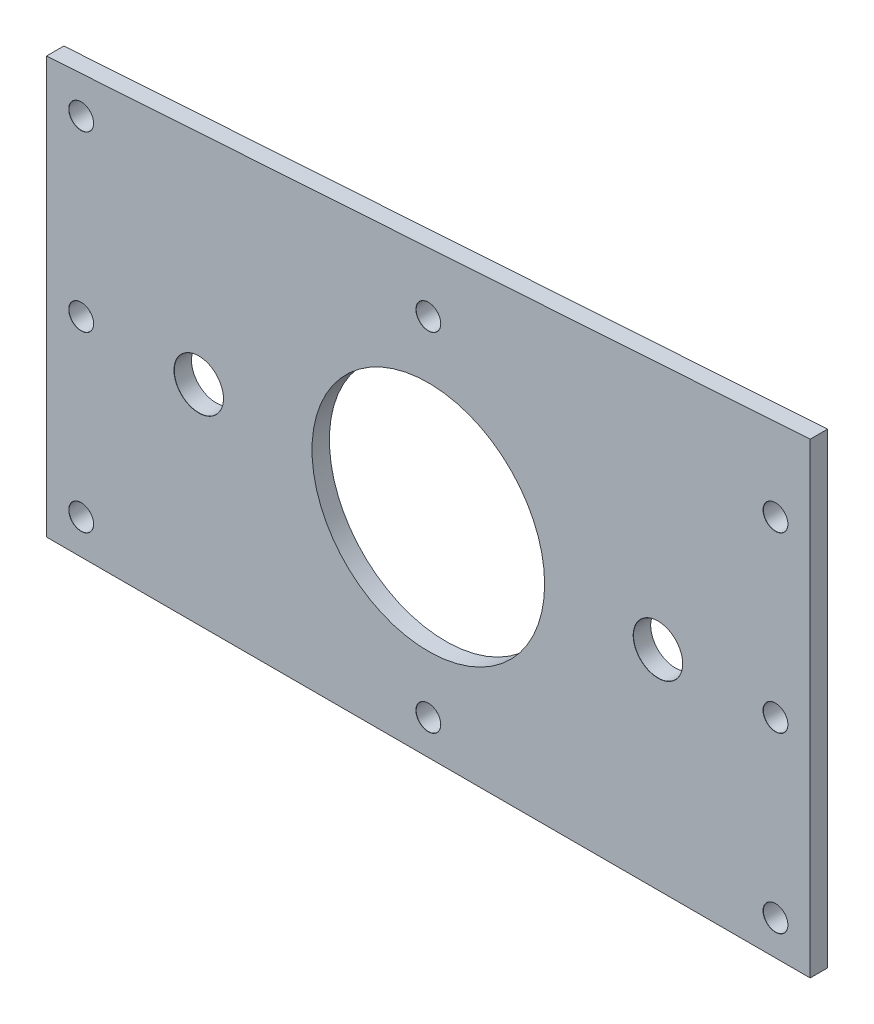
ISO-10303-21;
HEADER;
FILE_DESCRIPTION(('STEP AP214'),'2;1');
FILE_NAME('part.step','',(''),(''),'','','');
FILE_SCHEMA(('AUTOMOTIVE_DESIGN { 1 0 10303 214 1 1 1 1 }'));
ENDSEC;
DATA;
#1=APPLICATION_CONTEXT('core data for automotive mechanical design processes');
#2=APPLICATION_PROTOCOL_DEFINITION('international standard','automotive_design',2000,#1);
#3=PRODUCT_CONTEXT('',#1,'mechanical');
#4=PRODUCT('Part','Part','',(#3));
#5=PRODUCT_RELATED_PRODUCT_CATEGORY('part','',(#4));
#6=PRODUCT_DEFINITION_FORMATION('','',#4);
#7=PRODUCT_DEFINITION_CONTEXT('part definition',#1,'design');
#8=PRODUCT_DEFINITION('design','',#6,#7);
#9=PRODUCT_DEFINITION_SHAPE('','',#8);
#10=(LENGTH_UNIT() NAMED_UNIT(*) SI_UNIT(.MILLI.,.METRE.));
#11=(NAMED_UNIT(*) PLANE_ANGLE_UNIT() SI_UNIT($,.RADIAN.));
#12=(NAMED_UNIT(*) SI_UNIT($,.STERADIAN.) SOLID_ANGLE_UNIT());
#13=UNCERTAINTY_MEASURE_WITH_UNIT(LENGTH_MEASURE(1.E-05),#10,'distance_accuracy_value','');
#14=(GEOMETRIC_REPRESENTATION_CONTEXT(3) GLOBAL_UNCERTAINTY_ASSIGNED_CONTEXT((#13)) GLOBAL_UNIT_ASSIGNED_CONTEXT((#10,
#11,#12)) REPRESENTATION_CONTEXT('',''));
#15=CARTESIAN_POINT('',(0.,0.,0.));
#16=DIRECTION('',(0.,0.,1.));
#17=DIRECTION('',(1.,0.,0.));
#18=AXIS2_PLACEMENT_3D('',#15,#16,#17);
#19=CARTESIAN_POINT('',(69.85,38.1,3.175));
#20=DIRECTION('',(-1.,0.,0.));
#21=DIRECTION('',(0.,0.,1.));
#22=AXIS2_PLACEMENT_3D('',#19,#20,#21);
#23=PLANE('',#22);
#24=DIRECTION('',(0.,1.,0.));
#25=VECTOR('',#24,1.);
#26=CARTESIAN_POINT('',(69.85,38.1,0.));
#27=LINE('',#26,#25);
#28=CARTESIAN_POINT('',(69.85,-38.1,0.));
#29=VERTEX_POINT('',#28);
#30=CARTESIAN_POINT('',(69.85,47.2564217552889,0.));
#31=VERTEX_POINT('',#30);
#32=EDGE_CURVE('E72',#29,#31,#27,.T.);
#33=ORIENTED_EDGE('',*,*,#32,.T.);
#34=DIRECTION('',(0.,0.,-1.));
#35=VECTOR('',#34,1.);
#36=CARTESIAN_POINT('',(69.85,47.2564217552889,3.175));
#37=LINE('',#36,#35);
#38=CARTESIAN_POINT('',(69.85,47.2564217552889,3.175));
#39=VERTEX_POINT('',#38);
#40=EDGE_CURVE('E11',#39,#31,#37,.T.);
#41=ORIENTED_EDGE('',*,*,#40,.F.);
#42=DIRECTION('',(0.,1.,0.));
#43=VECTOR('',#42,1.);
#44=CARTESIAN_POINT('',(69.85,38.1,3.175));
#45=LINE('',#44,#43);
#46=CARTESIAN_POINT('',(69.85,-38.1,3.175));
#47=VERTEX_POINT('',#46);
#48=EDGE_CURVE('E77',#47,#39,#45,.T.);
#49=ORIENTED_EDGE('',*,*,#48,.F.);
#50=DIRECTION('',(0.,0.,-1.));
#51=VECTOR('',#50,1.);
#52=CARTESIAN_POINT('',(69.85,-38.1,3.175));
#53=LINE('',#52,#51);
#54=EDGE_CURVE('E92',#47,#29,#53,.T.);
#55=ORIENTED_EDGE('',*,*,#54,.T.);
#56=EDGE_LOOP('',(#33,#41,#49,#55));
#57=FACE_BOUND('',#56,.T.);
#58=ADVANCED_FACE('F32',(#57),#23,.F.);
#59=CARTESIAN_POINT('',(-69.85,38.1,3.175));
#60=DIRECTION('',(0.0654031292301437,-0.997858923238603,0.));
#61=DIRECTION('',(0.997858923238603,0.0654031292301437,0.));
#62=AXIS2_PLACEMENT_3D('',#59,#60,#61);
#63=PLANE('',#62);
#64=DIRECTION('',(-0.997858923238604,-0.0654031292301437,0.));
#65=VECTOR('',#64,1.);
#66=CARTESIAN_POINT('',(-69.85,38.1,0.));
#67=LINE('',#66,#65);
#68=CARTESIAN_POINT('',(-69.85,38.1,0.));
#69=VERTEX_POINT('',#68);
#70=EDGE_CURVE('E88',#31,#69,#67,.T.);
#71=ORIENTED_EDGE('',*,*,#70,.T.);
#72=DIRECTION('',(0.,0.,-1.));
#73=VECTOR('',#72,1.);
#74=CARTESIAN_POINT('',(-69.85,38.1,3.175));
#75=LINE('',#74,#73);
#76=CARTESIAN_POINT('',(-69.85,38.1,3.175));
#77=VERTEX_POINT('',#76);
#78=EDGE_CURVE('E40',#77,#69,#75,.T.);
#79=ORIENTED_EDGE('',*,*,#78,.F.);
#80=DIRECTION('',(-0.997858923238604,-0.0654031292301437,0.));
#81=VECTOR('',#80,1.);
#82=CARTESIAN_POINT('',(-69.85,38.1,3.175));
#83=LINE('',#82,#81);
#84=EDGE_CURVE('E80',#39,#77,#83,.T.);
#85=ORIENTED_EDGE('',*,*,#84,.F.);
#86=ORIENTED_EDGE('',*,*,#40,.T.);
#87=EDGE_LOOP('',(#71,#79,#85,#86));
#88=FACE_BOUND('',#87,.T.);
#89=ADVANCED_FACE('F87',(#88),#63,.F.);
#90=CARTESIAN_POINT('',(-69.85,38.1,3.175));
#91=DIRECTION('',(1.,0.,0.));
#92=DIRECTION('',(0.,0.,-1.));
#93=AXIS2_PLACEMENT_3D('',#90,#91,#92);
#94=PLANE('',#93);
#95=DIRECTION('',(0.,-1.,0.));
#96=VECTOR('',#95,1.);
#97=CARTESIAN_POINT('',(-69.85,38.1,0.));
#98=LINE('',#97,#96);
#99=CARTESIAN_POINT('',(-69.85,-38.1,0.));
#100=VERTEX_POINT('',#99);
#101=EDGE_CURVE('E65',#69,#100,#98,.T.);
#102=ORIENTED_EDGE('',*,*,#101,.T.);
#103=DIRECTION('',(0.,0.,-1.));
#104=VECTOR('',#103,1.);
#105=CARTESIAN_POINT('',(-69.85,-38.1,3.175));
#106=LINE('',#105,#104);
#107=CARTESIAN_POINT('',(-69.85,-38.1,3.175));
#108=VERTEX_POINT('',#107);
#109=EDGE_CURVE('E89',#108,#100,#106,.T.);
#110=ORIENTED_EDGE('',*,*,#109,.F.);
#111=DIRECTION('',(0.,-1.,0.));
#112=VECTOR('',#111,1.);
#113=CARTESIAN_POINT('',(-69.85,38.1,3.175));
#114=LINE('',#113,#112);
#115=EDGE_CURVE('E84',#77,#108,#114,.T.);
#116=ORIENTED_EDGE('',*,*,#115,.F.);
#117=ORIENTED_EDGE('',*,*,#78,.T.);
#118=EDGE_LOOP('',(#102,#110,#116,#117));
#119=FACE_BOUND('',#118,.T.);
#120=ADVANCED_FACE('F90',(#119),#94,.F.);
#121=CARTESIAN_POINT('',(-69.85,-38.1,3.175));
#122=DIRECTION('',(0.,1.,0.));
#123=DIRECTION('',(0.,0.,1.));
#124=AXIS2_PLACEMENT_3D('',#121,#122,#123);
#125=PLANE('',#124);
#126=DIRECTION('',(1.,0.,0.));
#127=VECTOR('',#126,1.);
#128=CARTESIAN_POINT('',(-69.85,-38.1,0.));
#129=LINE('',#128,#127);
#130=EDGE_CURVE('E100',#100,#29,#129,.T.);
#131=ORIENTED_EDGE('',*,*,#130,.T.);
#132=ORIENTED_EDGE('',*,*,#54,.F.);
#133=DIRECTION('',(1.,0.,0.));
#134=VECTOR('',#133,1.);
#135=CARTESIAN_POINT('',(-69.85,-38.1,3.175));
#136=LINE('',#135,#134);
#137=EDGE_CURVE('E48',#108,#47,#136,.T.);
#138=ORIENTED_EDGE('',*,*,#137,.F.);
#139=ORIENTED_EDGE('',*,*,#109,.T.);
#140=EDGE_LOOP('',(#131,#132,#138,#139));
#141=FACE_BOUND('',#140,.T.);
#142=ADVANCED_FACE('F105',(#141),#125,.F.);
#143=CARTESIAN_POINT('',(0.,0.,3.175));
#144=DIRECTION('',(0.,0.,1.));
#145=DIRECTION('',(1.,0.,0.));
#146=AXIS2_PLACEMENT_3D('',#143,#144,#145);
#147=PLANE('',#146);
#148=CARTESIAN_POINT('',(0.,0.,3.175));
#149=DIRECTION('',(0.,0.,1.));
#150=DIRECTION('',(1.,0.,0.));
#151=AXIS2_PLACEMENT_3D('',#148,#149,#150);
#152=CIRCLE('',#151,21.275);
#153=CARTESIAN_POINT('',(21.275,0.,3.175));
#154=VERTEX_POINT('',#153);
#155=EDGE_CURVE('E219',#154,#154,#152,.T.);
#156=ORIENTED_EDGE('',*,*,#155,.F.);
#157=EDGE_LOOP('',(#156));
#158=FACE_BOUND('',#157,.T.);
#159=CARTESIAN_POINT('',(-42.,0.,3.175));
#160=DIRECTION('',(0.,0.,1.));
#161=DIRECTION('',(1.,0.,0.));
#162=AXIS2_PLACEMENT_3D('',#159,#160,#161);
#163=CIRCLE('',#162,4.525);
#164=CARTESIAN_POINT('',(-37.475,0.,3.175));
#165=VERTEX_POINT('',#164);
#166=EDGE_CURVE('E215',#165,#165,#163,.T.);
#167=ORIENTED_EDGE('',*,*,#166,.F.);
#168=EDGE_LOOP('',(#167));
#169=FACE_BOUND('',#168,.T.);
#170=CARTESIAN_POINT('',(42.,0.,3.175));
#171=DIRECTION('',(0.,0.,1.));
#172=DIRECTION('',(1.,0.,0.));
#173=AXIS2_PLACEMENT_3D('',#170,#171,#172);
#174=CIRCLE('',#173,4.525);
#175=CARTESIAN_POINT('',(46.525,0.,3.175));
#176=VERTEX_POINT('',#175);
#177=EDGE_CURVE('E206',#176,#176,#174,.T.);
#178=ORIENTED_EDGE('',*,*,#177,.F.);
#179=EDGE_LOOP('',(#178));
#180=FACE_BOUND('',#179,.T.);
#181=CARTESIAN_POINT('',(-63.5,-31.75,3.175));
#182=DIRECTION('',(0.,0.,1.));
#183=DIRECTION('',(1.,0.,0.));
#184=AXIS2_PLACEMENT_3D('',#181,#182,#183);
#185=CIRCLE('',#184,2.275);
#186=CARTESIAN_POINT('',(-61.225,-31.75,3.175));
#187=VERTEX_POINT('',#186);
#188=EDGE_CURVE('E197',#187,#187,#185,.T.);
#189=ORIENTED_EDGE('',*,*,#188,.F.);
#190=EDGE_LOOP('',(#189));
#191=FACE_BOUND('',#190,.T.);
#192=CARTESIAN_POINT('',(0.,-31.75,3.175));
#193=DIRECTION('',(0.,0.,1.));
#194=DIRECTION('',(1.,0.,0.));
#195=AXIS2_PLACEMENT_3D('',#192,#193,#194);
#196=CIRCLE('',#195,2.275);
#197=CARTESIAN_POINT('',(2.275,-31.75,3.175));
#198=VERTEX_POINT('',#197);
#199=EDGE_CURVE('E188',#198,#198,#196,.T.);
#200=ORIENTED_EDGE('',*,*,#199,.F.);
#201=EDGE_LOOP('',(#200));
#202=FACE_BOUND('',#201,.T.);
#203=CARTESIAN_POINT('',(63.5,-31.75,3.175));
#204=DIRECTION('',(0.,0.,1.));
#205=DIRECTION('',(1.,0.,0.));
#206=AXIS2_PLACEMENT_3D('',#203,#204,#205);
#207=CIRCLE('',#206,2.275);
#208=CARTESIAN_POINT('',(65.775,-31.75,3.175));
#209=VERTEX_POINT('',#208);
#210=EDGE_CURVE('E179',#209,#209,#207,.T.);
#211=ORIENTED_EDGE('',*,*,#210,.F.);
#212=EDGE_LOOP('',(#211));
#213=FACE_BOUND('',#212,.T.);
#214=CARTESIAN_POINT('',(63.5,31.75,3.175));
#215=DIRECTION('',(0.,0.,1.));
#216=DIRECTION('',(1.,0.,0.));
#217=AXIS2_PLACEMENT_3D('',#214,#215,#216);
#218=CIRCLE('',#217,2.275);
#219=CARTESIAN_POINT('',(65.775,31.75,3.175));
#220=VERTEX_POINT('',#219);
#221=EDGE_CURVE('E170',#220,#220,#218,.T.);
#222=ORIENTED_EDGE('',*,*,#221,.F.);
#223=EDGE_LOOP('',(#222));
#224=FACE_BOUND('',#223,.T.);
#225=CARTESIAN_POINT('',(63.5,0.,3.175));
#226=DIRECTION('',(0.,0.,1.));
#227=DIRECTION('',(1.,0.,0.));
#228=AXIS2_PLACEMENT_3D('',#225,#226,#227);
#229=CIRCLE('',#228,2.275);
#230=CARTESIAN_POINT('',(65.775,0.,3.175));
#231=VERTEX_POINT('',#230);
#232=EDGE_CURVE('E161',#231,#231,#229,.T.);
#233=ORIENTED_EDGE('',*,*,#232,.F.);
#234=EDGE_LOOP('',(#233));
#235=FACE_BOUND('',#234,.T.);
#236=CARTESIAN_POINT('',(0.,31.75,3.175));
#237=DIRECTION('',(0.,0.,1.));
#238=DIRECTION('',(1.,0.,0.));
#239=AXIS2_PLACEMENT_3D('',#236,#237,#238);
#240=CIRCLE('',#239,2.275);
#241=CARTESIAN_POINT('',(2.27499999999999,31.75,3.175));
#242=VERTEX_POINT('',#241);
#243=EDGE_CURVE('E152',#242,#242,#240,.T.);
#244=ORIENTED_EDGE('',*,*,#243,.F.);
#245=EDGE_LOOP('',(#244));
#246=FACE_BOUND('',#245,.T.);
#247=CARTESIAN_POINT('',(-63.5,31.75,3.175));
#248=DIRECTION('',(0.,0.,1.));
#249=DIRECTION('',(1.,0.,0.));
#250=AXIS2_PLACEMENT_3D('',#247,#248,#249);
#251=CIRCLE('',#250,2.275);
#252=CARTESIAN_POINT('',(-61.225,31.75,3.175));
#253=VERTEX_POINT('',#252);
#254=EDGE_CURVE('E143',#253,#253,#251,.T.);
#255=ORIENTED_EDGE('',*,*,#254,.F.);
#256=EDGE_LOOP('',(#255));
#257=FACE_BOUND('',#256,.T.);
#258=CARTESIAN_POINT('',(-63.5,0.,3.175));
#259=DIRECTION('',(0.,0.,1.));
#260=DIRECTION('',(1.,0.,0.));
#261=AXIS2_PLACEMENT_3D('',#258,#259,#260);
#262=CIRCLE('',#261,2.275);
#263=CARTESIAN_POINT('',(-61.225,0.,3.175));
#264=VERTEX_POINT('',#263);
#265=EDGE_CURVE('E134',#264,#264,#262,.T.);
#266=ORIENTED_EDGE('',*,*,#265,.F.);
#267=EDGE_LOOP('',(#266));
#268=FACE_BOUND('',#267,.T.);
#269=ORIENTED_EDGE('',*,*,#48,.T.);
#270=ORIENTED_EDGE('',*,*,#84,.T.);
#271=ORIENTED_EDGE('',*,*,#115,.T.);
#272=ORIENTED_EDGE('',*,*,#137,.T.);
#273=EDGE_LOOP('',(#269,#270,#271,#272));
#274=FACE_BOUND('',#273,.T.);
#275=ADVANCED_FACE('F82',(#158,#169,#180,#191,#202,#213,#224,#235,#246,#257,#268,#274),#147,.T.);
#276=CARTESIAN_POINT('',(0.,0.,0.));
#277=DIRECTION('',(0.,0.,1.));
#278=DIRECTION('',(1.,0.,0.));
#279=AXIS2_PLACEMENT_3D('',#276,#277,#278);
#280=PLANE('',#279);
#281=CARTESIAN_POINT('',(0.,0.,0.));
#282=DIRECTION('',(0.,0.,1.));
#283=DIRECTION('',(1.,0.,0.));
#284=AXIS2_PLACEMENT_3D('',#281,#282,#283);
#285=CIRCLE('',#284,21.275);
#286=CARTESIAN_POINT('',(21.275,0.,0.));
#287=VERTEX_POINT('',#286);
#288=EDGE_CURVE('E218',#287,#287,#285,.T.);
#289=ORIENTED_EDGE('',*,*,#288,.T.);
#290=EDGE_LOOP('',(#289));
#291=FACE_BOUND('',#290,.T.);
#292=CARTESIAN_POINT('',(-42.,0.,0.));
#293=DIRECTION('',(0.,0.,1.));
#294=DIRECTION('',(1.,0.,0.));
#295=AXIS2_PLACEMENT_3D('',#292,#293,#294);
#296=CIRCLE('',#295,4.5);
#297=CARTESIAN_POINT('',(-37.5,0.,0.));
#298=VERTEX_POINT('',#297);
#299=EDGE_CURVE('E209',#298,#298,#296,.T.);
#300=ORIENTED_EDGE('',*,*,#299,.T.);
#301=EDGE_LOOP('',(#300));
#302=FACE_BOUND('',#301,.T.);
#303=CARTESIAN_POINT('',(42.,0.,0.));
#304=DIRECTION('',(0.,0.,1.));
#305=DIRECTION('',(1.,0.,0.));
#306=AXIS2_PLACEMENT_3D('',#303,#304,#305);
#307=CIRCLE('',#306,4.5);
#308=CARTESIAN_POINT('',(46.5,0.,0.));
#309=VERTEX_POINT('',#308);
#310=EDGE_CURVE('E200',#309,#309,#307,.T.);
#311=ORIENTED_EDGE('',*,*,#310,.T.);
#312=EDGE_LOOP('',(#311));
#313=FACE_BOUND('',#312,.T.);
#314=CARTESIAN_POINT('',(-63.5,-31.75,0.));
#315=DIRECTION('',(0.,0.,1.));
#316=DIRECTION('',(1.,0.,0.));
#317=AXIS2_PLACEMENT_3D('',#314,#315,#316);
#318=CIRCLE('',#317,2.25);
#319=CARTESIAN_POINT('',(-61.25,-31.75,0.));
#320=VERTEX_POINT('',#319);
#321=EDGE_CURVE('E191',#320,#320,#318,.T.);
#322=ORIENTED_EDGE('',*,*,#321,.T.);
#323=EDGE_LOOP('',(#322));
#324=FACE_BOUND('',#323,.T.);
#325=CARTESIAN_POINT('',(0.,-31.75,0.));
#326=DIRECTION('',(0.,0.,1.));
#327=DIRECTION('',(1.,0.,0.));
#328=AXIS2_PLACEMENT_3D('',#325,#326,#327);
#329=CIRCLE('',#328,2.25);
#330=CARTESIAN_POINT('',(2.25,-31.75,0.));
#331=VERTEX_POINT('',#330);
#332=EDGE_CURVE('E182',#331,#331,#329,.T.);
#333=ORIENTED_EDGE('',*,*,#332,.T.);
#334=EDGE_LOOP('',(#333));
#335=FACE_BOUND('',#334,.T.);
#336=CARTESIAN_POINT('',(63.5,-31.75,0.));
#337=DIRECTION('',(0.,0.,1.));
#338=DIRECTION('',(1.,0.,0.));
#339=AXIS2_PLACEMENT_3D('',#336,#337,#338);
#340=CIRCLE('',#339,2.25);
#341=CARTESIAN_POINT('',(65.75,-31.75,0.));
#342=VERTEX_POINT('',#341);
#343=EDGE_CURVE('E173',#342,#342,#340,.T.);
#344=ORIENTED_EDGE('',*,*,#343,.T.);
#345=EDGE_LOOP('',(#344));
#346=FACE_BOUND('',#345,.T.);
#347=CARTESIAN_POINT('',(63.5,31.75,0.));
#348=DIRECTION('',(0.,0.,1.));
#349=DIRECTION('',(1.,0.,0.));
#350=AXIS2_PLACEMENT_3D('',#347,#348,#349);
#351=CIRCLE('',#350,2.25);
#352=CARTESIAN_POINT('',(65.75,31.75,0.));
#353=VERTEX_POINT('',#352);
#354=EDGE_CURVE('E164',#353,#353,#351,.T.);
#355=ORIENTED_EDGE('',*,*,#354,.T.);
#356=EDGE_LOOP('',(#355));
#357=FACE_BOUND('',#356,.T.);
#358=CARTESIAN_POINT('',(63.5,0.,0.));
#359=DIRECTION('',(0.,0.,1.));
#360=DIRECTION('',(1.,0.,0.));
#361=AXIS2_PLACEMENT_3D('',#358,#359,#360);
#362=CIRCLE('',#361,2.25);
#363=CARTESIAN_POINT('',(65.75,0.,0.));
#364=VERTEX_POINT('',#363);
#365=EDGE_CURVE('E155',#364,#364,#362,.T.);
#366=ORIENTED_EDGE('',*,*,#365,.T.);
#367=EDGE_LOOP('',(#366));
#368=FACE_BOUND('',#367,.T.);
#369=CARTESIAN_POINT('',(0.,31.75,0.));
#370=DIRECTION('',(0.,0.,1.));
#371=DIRECTION('',(1.,0.,0.));
#372=AXIS2_PLACEMENT_3D('',#369,#370,#371);
#373=CIRCLE('',#372,2.25);
#374=CARTESIAN_POINT('',(2.24999999999999,31.75,0.));
#375=VERTEX_POINT('',#374);
#376=EDGE_CURVE('E146',#375,#375,#373,.T.);
#377=ORIENTED_EDGE('',*,*,#376,.T.);
#378=EDGE_LOOP('',(#377));
#379=FACE_BOUND('',#378,.T.);
#380=CARTESIAN_POINT('',(-63.5,31.75,0.));
#381=DIRECTION('',(0.,0.,1.));
#382=DIRECTION('',(1.,0.,0.));
#383=AXIS2_PLACEMENT_3D('',#380,#381,#382);
#384=CIRCLE('',#383,2.25);
#385=CARTESIAN_POINT('',(-61.25,31.75,0.));
#386=VERTEX_POINT('',#385);
#387=EDGE_CURVE('E137',#386,#386,#384,.T.);
#388=ORIENTED_EDGE('',*,*,#387,.T.);
#389=EDGE_LOOP('',(#388));
#390=FACE_BOUND('',#389,.T.);
#391=CARTESIAN_POINT('',(-63.5,0.,0.));
#392=DIRECTION('',(0.,0.,1.));
#393=DIRECTION('',(1.,0.,0.));
#394=AXIS2_PLACEMENT_3D('',#391,#392,#393);
#395=CIRCLE('',#394,2.25);
#396=CARTESIAN_POINT('',(-61.25,0.,0.));
#397=VERTEX_POINT('',#396);
#398=EDGE_CURVE('E97',#397,#397,#395,.T.);
#399=ORIENTED_EDGE('',*,*,#398,.T.);
#400=EDGE_LOOP('',(#399));
#401=FACE_BOUND('',#400,.T.);
#402=ORIENTED_EDGE('',*,*,#32,.F.);
#403=ORIENTED_EDGE('',*,*,#130,.F.);
#404=ORIENTED_EDGE('',*,*,#101,.F.);
#405=ORIENTED_EDGE('',*,*,#70,.F.);
#406=EDGE_LOOP('',(#402,#403,#404,#405));
#407=FACE_BOUND('',#406,.T.);
#408=ADVANCED_FACE('F106',(#291,#302,#313,#324,#335,#346,#357,#368,#379,#390,#401,#407),#280,.F.);
#409=CARTESIAN_POINT('',(-63.5,0.,3.175));
#410=DIRECTION('',(0.,0.,1.));
#411=DIRECTION('',(1.,0.,0.));
#412=AXIS2_PLACEMENT_3D('',#409,#410,#411);
#413=CYLINDRICAL_SURFACE('',#412,2.25);
#414=ORIENTED_EDGE('',*,*,#398,.F.);
#415=EDGE_LOOP('',(#414));
#416=FACE_BOUND('',#415,.T.);
#417=CARTESIAN_POINT('',(-63.5,0.,3.15));
#418=DIRECTION('',(0.,0.,1.));
#419=DIRECTION('',(1.,0.,0.));
#420=AXIS2_PLACEMENT_3D('',#417,#418,#419);
#421=CIRCLE('',#420,2.25);
#422=CARTESIAN_POINT('',(-61.25,0.,3.15));
#423=VERTEX_POINT('',#422);
#424=EDGE_CURVE('E131',#423,#423,#421,.T.);
#425=ORIENTED_EDGE('',*,*,#424,.T.);
#426=EDGE_LOOP('',(#425));
#427=FACE_BOUND('',#426,.T.);
#428=ADVANCED_FACE('F108',(#416,#427),#413,.F.);
#429=CARTESIAN_POINT('',(-63.5,0.,3.175));
#430=DIRECTION('',(0.,0.,1.));
#431=DIRECTION('',(1.,0.,0.));
#432=AXIS2_PLACEMENT_3D('',#429,#430,#431);
#433=CONICAL_SURFACE('',#432,2.275,0.785398163397353);
#434=ORIENTED_EDGE('',*,*,#424,.F.);
#435=EDGE_LOOP('',(#434));
#436=FACE_BOUND('',#435,.T.);
#437=ORIENTED_EDGE('',*,*,#265,.T.);
#438=EDGE_LOOP('',(#437));
#439=FACE_BOUND('',#438,.T.);
#440=ADVANCED_FACE('F115',(#436,#439),#433,.F.);
#441=CARTESIAN_POINT('',(-63.5,31.75,3.175));
#442=DIRECTION('',(0.,0.,1.));
#443=DIRECTION('',(1.,0.,0.));
#444=AXIS2_PLACEMENT_3D('',#441,#442,#443);
#445=CYLINDRICAL_SURFACE('',#444,2.25);
#446=ORIENTED_EDGE('',*,*,#387,.F.);
#447=EDGE_LOOP('',(#446));
#448=FACE_BOUND('',#447,.T.);
#449=CARTESIAN_POINT('',(-63.5,31.75,3.15));
#450=DIRECTION('',(0.,0.,1.));
#451=DIRECTION('',(1.,0.,0.));
#452=AXIS2_PLACEMENT_3D('',#449,#450,#451);
#453=CIRCLE('',#452,2.25);
#454=CARTESIAN_POINT('',(-61.25,31.75,3.15));
#455=VERTEX_POINT('',#454);
#456=EDGE_CURVE('E140',#455,#455,#453,.T.);
#457=ORIENTED_EDGE('',*,*,#456,.T.);
#458=EDGE_LOOP('',(#457));
#459=FACE_BOUND('',#458,.T.);
#460=ADVANCED_FACE('F252',(#448,#459),#445,.F.);
#461=CARTESIAN_POINT('',(-63.5,31.75,3.175));
#462=DIRECTION('',(0.,0.,1.));
#463=DIRECTION('',(1.,0.,0.));
#464=AXIS2_PLACEMENT_3D('',#461,#462,#463);
#465=CONICAL_SURFACE('',#464,2.275,0.785398163397353);
#466=ORIENTED_EDGE('',*,*,#456,.F.);
#467=EDGE_LOOP('',(#466));
#468=FACE_BOUND('',#467,.T.);
#469=ORIENTED_EDGE('',*,*,#254,.T.);
#470=EDGE_LOOP('',(#469));
#471=FACE_BOUND('',#470,.T.);
#472=ADVANCED_FACE('F258',(#468,#471),#465,.F.);
#473=CARTESIAN_POINT('',(0.,31.75,3.175));
#474=DIRECTION('',(0.,0.,1.));
#475=DIRECTION('',(1.,0.,0.));
#476=AXIS2_PLACEMENT_3D('',#473,#474,#475);
#477=CYLINDRICAL_SURFACE('',#476,2.25);
#478=ORIENTED_EDGE('',*,*,#376,.F.);
#479=EDGE_LOOP('',(#478));
#480=FACE_BOUND('',#479,.T.);
#481=CARTESIAN_POINT('',(0.,31.75,3.15));
#482=DIRECTION('',(0.,0.,1.));
#483=DIRECTION('',(1.,0.,0.));
#484=AXIS2_PLACEMENT_3D('',#481,#482,#483);
#485=CIRCLE('',#484,2.25);
#486=CARTESIAN_POINT('',(2.24999999999999,31.75,3.15));
#487=VERTEX_POINT('',#486);
#488=EDGE_CURVE('E149',#487,#487,#485,.T.);
#489=ORIENTED_EDGE('',*,*,#488,.T.);
#490=EDGE_LOOP('',(#489));
#491=FACE_BOUND('',#490,.T.);
#492=ADVANCED_FACE('F265',(#480,#491),#477,.F.);
#493=CARTESIAN_POINT('',(0.,31.75,3.175));
#494=DIRECTION('',(0.,0.,1.));
#495=DIRECTION('',(1.,0.,0.));
#496=AXIS2_PLACEMENT_3D('',#493,#494,#495);
#497=CONICAL_SURFACE('',#496,2.275,0.785398163397396);
#498=ORIENTED_EDGE('',*,*,#488,.F.);
#499=EDGE_LOOP('',(#498));
#500=FACE_BOUND('',#499,.T.);
#501=ORIENTED_EDGE('',*,*,#243,.T.);
#502=EDGE_LOOP('',(#501));
#503=FACE_BOUND('',#502,.T.);
#504=ADVANCED_FACE('F269',(#500,#503),#497,.F.);
#505=CARTESIAN_POINT('',(63.5,0.,3.175));
#506=DIRECTION('',(0.,0.,1.));
#507=DIRECTION('',(1.,0.,0.));
#508=AXIS2_PLACEMENT_3D('',#505,#506,#507);
#509=CYLINDRICAL_SURFACE('',#508,2.25);
#510=ORIENTED_EDGE('',*,*,#365,.F.);
#511=EDGE_LOOP('',(#510));
#512=FACE_BOUND('',#511,.T.);
#513=CARTESIAN_POINT('',(63.5,0.,3.15));
#514=DIRECTION('',(0.,0.,1.));
#515=DIRECTION('',(1.,0.,0.));
#516=AXIS2_PLACEMENT_3D('',#513,#514,#515);
#517=CIRCLE('',#516,2.25);
#518=CARTESIAN_POINT('',(65.75,0.,3.15));
#519=VERTEX_POINT('',#518);
#520=EDGE_CURVE('E158',#519,#519,#517,.T.);
#521=ORIENTED_EDGE('',*,*,#520,.T.);
#522=EDGE_LOOP('',(#521));
#523=FACE_BOUND('',#522,.T.);
#524=ADVANCED_FACE('F273',(#512,#523),#509,.F.);
#525=CARTESIAN_POINT('',(63.5,0.,3.175));
#526=DIRECTION('',(0.,0.,1.));
#527=DIRECTION('',(1.,0.,0.));
#528=AXIS2_PLACEMENT_3D('',#525,#526,#527);
#529=CONICAL_SURFACE('',#528,2.275,0.785398163397353);
#530=ORIENTED_EDGE('',*,*,#520,.F.);
#531=EDGE_LOOP('',(#530));
#532=FACE_BOUND('',#531,.T.);
#533=ORIENTED_EDGE('',*,*,#232,.T.);
#534=EDGE_LOOP('',(#533));
#535=FACE_BOUND('',#534,.T.);
#536=ADVANCED_FACE('F277',(#532,#535),#529,.F.);
#537=CARTESIAN_POINT('',(63.5,31.75,3.175));
#538=DIRECTION('',(0.,0.,1.));
#539=DIRECTION('',(1.,0.,0.));
#540=AXIS2_PLACEMENT_3D('',#537,#538,#539);
#541=CYLINDRICAL_SURFACE('',#540,2.25);
#542=ORIENTED_EDGE('',*,*,#354,.F.);
#543=EDGE_LOOP('',(#542));
#544=FACE_BOUND('',#543,.T.);
#545=CARTESIAN_POINT('',(63.5,31.75,3.15));
#546=DIRECTION('',(0.,0.,1.));
#547=DIRECTION('',(1.,0.,0.));
#548=AXIS2_PLACEMENT_3D('',#545,#546,#547);
#549=CIRCLE('',#548,2.25);
#550=CARTESIAN_POINT('',(65.75,31.75,3.15));
#551=VERTEX_POINT('',#550);
#552=EDGE_CURVE('E167',#551,#551,#549,.T.);
#553=ORIENTED_EDGE('',*,*,#552,.T.);
#554=EDGE_LOOP('',(#553));
#555=FACE_BOUND('',#554,.T.);
#556=ADVANCED_FACE('F281',(#544,#555),#541,.F.);
#557=CARTESIAN_POINT('',(63.5,31.75,3.175));
#558=DIRECTION('',(0.,0.,1.));
#559=DIRECTION('',(1.,0.,0.));
#560=AXIS2_PLACEMENT_3D('',#557,#558,#559);
#561=CONICAL_SURFACE('',#560,2.275,0.785398163397353);
#562=ORIENTED_EDGE('',*,*,#552,.F.);
#563=EDGE_LOOP('',(#562));
#564=FACE_BOUND('',#563,.T.);
#565=ORIENTED_EDGE('',*,*,#221,.T.);
#566=EDGE_LOOP('',(#565));
#567=FACE_BOUND('',#566,.T.);
#568=ADVANCED_FACE('F285',(#564,#567),#561,.F.);
#569=CARTESIAN_POINT('',(63.5,-31.75,3.175));
#570=DIRECTION('',(0.,0.,1.));
#571=DIRECTION('',(1.,0.,0.));
#572=AXIS2_PLACEMENT_3D('',#569,#570,#571);
#573=CYLINDRICAL_SURFACE('',#572,2.25);
#574=ORIENTED_EDGE('',*,*,#343,.F.);
#575=EDGE_LOOP('',(#574));
#576=FACE_BOUND('',#575,.T.);
#577=CARTESIAN_POINT('',(63.5,-31.75,3.15));
#578=DIRECTION('',(0.,0.,1.));
#579=DIRECTION('',(1.,0.,0.));
#580=AXIS2_PLACEMENT_3D('',#577,#578,#579);
#581=CIRCLE('',#580,2.25);
#582=CARTESIAN_POINT('',(65.75,-31.75,3.15));
#583=VERTEX_POINT('',#582);
#584=EDGE_CURVE('E176',#583,#583,#581,.T.);
#585=ORIENTED_EDGE('',*,*,#584,.T.);
#586=EDGE_LOOP('',(#585));
#587=FACE_BOUND('',#586,.T.);
#588=ADVANCED_FACE('F289',(#576,#587),#573,.F.);
#589=CARTESIAN_POINT('',(63.5,-31.75,3.175));
#590=DIRECTION('',(0.,0.,1.));
#591=DIRECTION('',(1.,0.,0.));
#592=AXIS2_PLACEMENT_3D('',#589,#590,#591);
#593=CONICAL_SURFACE('',#592,2.275,0.785398163397353);
#594=ORIENTED_EDGE('',*,*,#584,.F.);
#595=EDGE_LOOP('',(#594));
#596=FACE_BOUND('',#595,.T.);
#597=ORIENTED_EDGE('',*,*,#210,.T.);
#598=EDGE_LOOP('',(#597));
#599=FACE_BOUND('',#598,.T.);
#600=ADVANCED_FACE('F293',(#596,#599),#593,.F.);
#601=CARTESIAN_POINT('',(0.,-31.75,3.175));
#602=DIRECTION('',(0.,0.,1.));
#603=DIRECTION('',(1.,0.,0.));
#604=AXIS2_PLACEMENT_3D('',#601,#602,#603);
#605=CYLINDRICAL_SURFACE('',#604,2.25);
#606=ORIENTED_EDGE('',*,*,#332,.F.);
#607=EDGE_LOOP('',(#606));
#608=FACE_BOUND('',#607,.T.);
#609=CARTESIAN_POINT('',(0.,-31.75,3.15));
#610=DIRECTION('',(0.,0.,1.));
#611=DIRECTION('',(1.,0.,0.));
#612=AXIS2_PLACEMENT_3D('',#609,#610,#611);
#613=CIRCLE('',#612,2.25);
#614=CARTESIAN_POINT('',(2.25,-31.75,3.15));
#615=VERTEX_POINT('',#614);
#616=EDGE_CURVE('E185',#615,#615,#613,.T.);
#617=ORIENTED_EDGE('',*,*,#616,.T.);
#618=EDGE_LOOP('',(#617));
#619=FACE_BOUND('',#618,.T.);
#620=ADVANCED_FACE('F297',(#608,#619),#605,.F.);
#621=CARTESIAN_POINT('',(0.,-31.75,3.175));
#622=DIRECTION('',(0.,0.,1.));
#623=DIRECTION('',(1.,0.,0.));
#624=AXIS2_PLACEMENT_3D('',#621,#622,#623);
#625=CONICAL_SURFACE('',#624,2.275,0.785398163397396);
#626=ORIENTED_EDGE('',*,*,#616,.F.);
#627=EDGE_LOOP('',(#626));
#628=FACE_BOUND('',#627,.T.);
#629=ORIENTED_EDGE('',*,*,#199,.T.);
#630=EDGE_LOOP('',(#629));
#631=FACE_BOUND('',#630,.T.);
#632=ADVANCED_FACE('F301',(#628,#631),#625,.F.);
#633=CARTESIAN_POINT('',(-63.5,-31.75,3.175));
#634=DIRECTION('',(0.,0.,1.));
#635=DIRECTION('',(1.,0.,0.));
#636=AXIS2_PLACEMENT_3D('',#633,#634,#635);
#637=CYLINDRICAL_SURFACE('',#636,2.25);
#638=ORIENTED_EDGE('',*,*,#321,.F.);
#639=EDGE_LOOP('',(#638));
#640=FACE_BOUND('',#639,.T.);
#641=CARTESIAN_POINT('',(-63.5,-31.75,3.15));
#642=DIRECTION('',(0.,0.,1.));
#643=DIRECTION('',(1.,0.,0.));
#644=AXIS2_PLACEMENT_3D('',#641,#642,#643);
#645=CIRCLE('',#644,2.25);
#646=CARTESIAN_POINT('',(-61.25,-31.75,3.15));
#647=VERTEX_POINT('',#646);
#648=EDGE_CURVE('E194',#647,#647,#645,.T.);
#649=ORIENTED_EDGE('',*,*,#648,.T.);
#650=EDGE_LOOP('',(#649));
#651=FACE_BOUND('',#650,.T.);
#652=ADVANCED_FACE('F305',(#640,#651),#637,.F.);
#653=CARTESIAN_POINT('',(-63.5,-31.75,3.175));
#654=DIRECTION('',(0.,0.,1.));
#655=DIRECTION('',(1.,0.,0.));
#656=AXIS2_PLACEMENT_3D('',#653,#654,#655);
#657=CONICAL_SURFACE('',#656,2.275,0.785398163397353);
#658=ORIENTED_EDGE('',*,*,#648,.F.);
#659=EDGE_LOOP('',(#658));
#660=FACE_BOUND('',#659,.T.);
#661=ORIENTED_EDGE('',*,*,#188,.T.);
#662=EDGE_LOOP('',(#661));
#663=FACE_BOUND('',#662,.T.);
#664=ADVANCED_FACE('F309',(#660,#663),#657,.F.);
#665=CARTESIAN_POINT('',(42.,0.,3.175));
#666=DIRECTION('',(0.,0.,1.));
#667=DIRECTION('',(1.,0.,0.));
#668=AXIS2_PLACEMENT_3D('',#665,#666,#667);
#669=CYLINDRICAL_SURFACE('',#668,4.5);
#670=ORIENTED_EDGE('',*,*,#310,.F.);
#671=EDGE_LOOP('',(#670));
#672=FACE_BOUND('',#671,.T.);
#673=CARTESIAN_POINT('',(42.,0.,3.15));
#674=DIRECTION('',(0.,0.,1.));
#675=DIRECTION('',(1.,0.,0.));
#676=AXIS2_PLACEMENT_3D('',#673,#674,#675);
#677=CIRCLE('',#676,4.5);
#678=CARTESIAN_POINT('',(46.5,0.,3.15));
#679=VERTEX_POINT('',#678);
#680=EDGE_CURVE('E203',#679,#679,#677,.T.);
#681=ORIENTED_EDGE('',*,*,#680,.T.);
#682=EDGE_LOOP('',(#681));
#683=FACE_BOUND('',#682,.T.);
#684=ADVANCED_FACE('F313',(#672,#683),#669,.F.);
#685=CARTESIAN_POINT('',(42.,0.,3.175));
#686=DIRECTION('',(0.,0.,1.));
#687=DIRECTION('',(1.,0.,0.));
#688=AXIS2_PLACEMENT_3D('',#685,#686,#687);
#689=CONICAL_SURFACE('',#688,4.525,0.7853981633975);
#690=ORIENTED_EDGE('',*,*,#680,.F.);
#691=EDGE_LOOP('',(#690));
#692=FACE_BOUND('',#691,.T.);
#693=ORIENTED_EDGE('',*,*,#177,.T.);
#694=EDGE_LOOP('',(#693));
#695=FACE_BOUND('',#694,.T.);
#696=ADVANCED_FACE('F317',(#692,#695),#689,.F.);
#697=CARTESIAN_POINT('',(-42.,0.,3.175));
#698=DIRECTION('',(0.,0.,1.));
#699=DIRECTION('',(1.,0.,0.));
#700=AXIS2_PLACEMENT_3D('',#697,#698,#699);
#701=CYLINDRICAL_SURFACE('',#700,4.5);
#702=ORIENTED_EDGE('',*,*,#299,.F.);
#703=EDGE_LOOP('',(#702));
#704=FACE_BOUND('',#703,.T.);
#705=CARTESIAN_POINT('',(-42.,0.,3.15));
#706=DIRECTION('',(0.,0.,1.));
#707=DIRECTION('',(1.,0.,0.));
#708=AXIS2_PLACEMENT_3D('',#705,#706,#707);
#709=CIRCLE('',#708,4.5);
#710=CARTESIAN_POINT('',(-37.5,0.,3.15));
#711=VERTEX_POINT('',#710);
#712=EDGE_CURVE('E212',#711,#711,#709,.T.);
#713=ORIENTED_EDGE('',*,*,#712,.T.);
#714=EDGE_LOOP('',(#713));
#715=FACE_BOUND('',#714,.T.);
#716=ADVANCED_FACE('F321',(#704,#715),#701,.F.);
#717=CARTESIAN_POINT('',(-42.,0.,3.175));
#718=DIRECTION('',(0.,0.,1.));
#719=DIRECTION('',(1.,0.,0.));
#720=AXIS2_PLACEMENT_3D('',#717,#718,#719);
#721=CONICAL_SURFACE('',#720,4.525,0.7853981633975);
#722=ORIENTED_EDGE('',*,*,#712,.F.);
#723=EDGE_LOOP('',(#722));
#724=FACE_BOUND('',#723,.T.);
#725=ORIENTED_EDGE('',*,*,#166,.T.);
#726=EDGE_LOOP('',(#725));
#727=FACE_BOUND('',#726,.T.);
#728=ADVANCED_FACE('F227',(#724,#727),#721,.F.);
#729=CARTESIAN_POINT('',(0.,0.,0.));
#730=DIRECTION('',(0.,0.,1.));
#731=DIRECTION('',(1.,0.,0.));
#732=AXIS2_PLACEMENT_3D('',#729,#730,#731);
#733=CYLINDRICAL_SURFACE('',#732,21.275);
#734=ORIENTED_EDGE('',*,*,#288,.F.);
#735=EDGE_LOOP('',(#734));
#736=FACE_BOUND('',#735,.T.);
#737=ORIENTED_EDGE('',*,*,#155,.T.);
#738=EDGE_LOOP('',(#737));
#739=FACE_BOUND('',#738,.T.);
#740=ADVANCED_FACE('F224',(#736,#739),#733,.F.);
#741=CLOSED_SHELL('',(#58,#89,#120,#142,#275,#408,#428,#440,#460,#472,#492,#504,#524,#536,#556,
#568,#588,#600,#620,#632,#652,#664,#684,#696,#716,#728,#740));
#742=MANIFOLD_SOLID_BREP('B2',#741);
#743=ADVANCED_BREP_SHAPE_REPRESENTATION('',(#18,#742),#14);
#744=SHAPE_DEFINITION_REPRESENTATION(#9,#743);
ENDSEC;
END-ISO-10303-21;
